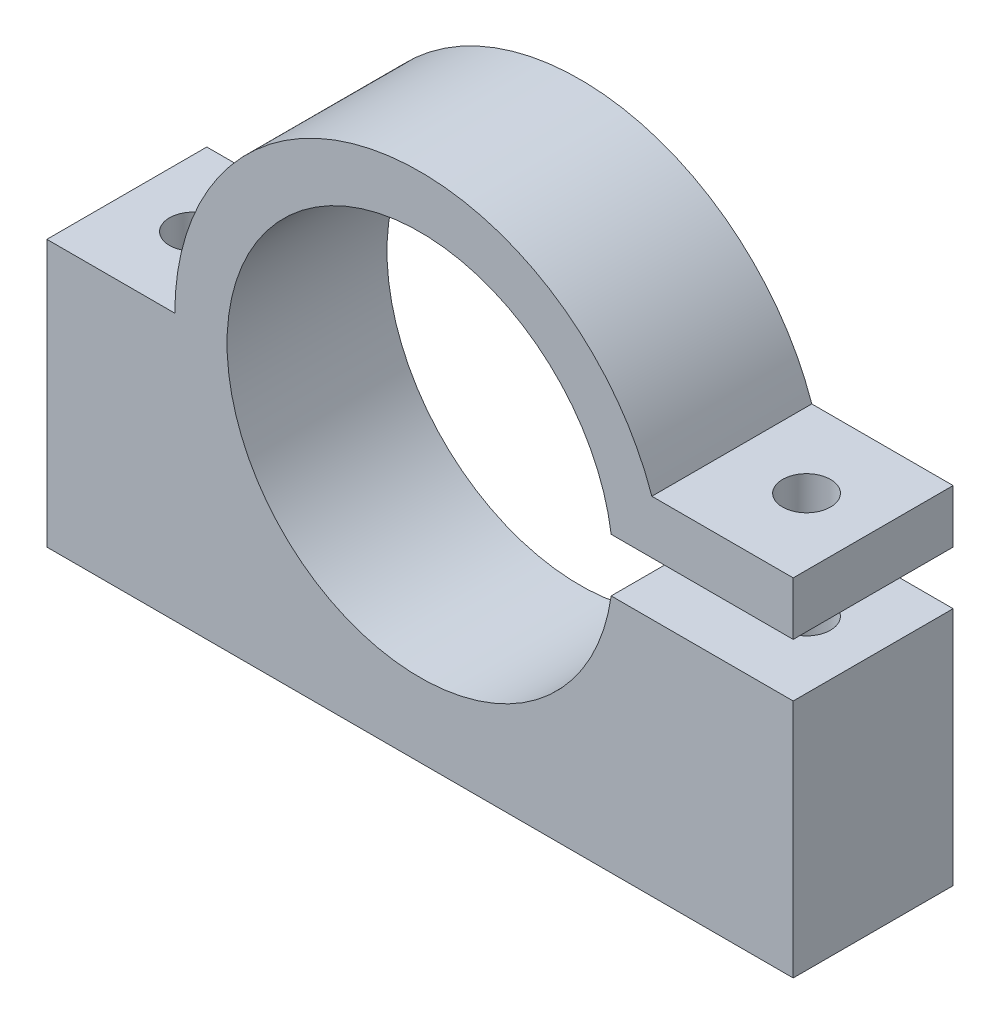
ISO-10303-21;
HEADER;
FILE_DESCRIPTION(('STEP AP214'),'2;1');
FILE_NAME('part.step','',(''),(''),'','','');
FILE_SCHEMA(('AUTOMOTIVE_DESIGN { 1 0 10303 214 1 1 1 1 }'));
ENDSEC;
DATA;
#1=APPLICATION_CONTEXT('core data for automotive mechanical design processes');
#2=APPLICATION_PROTOCOL_DEFINITION('international standard','automotive_design',2000,#1);
#3=PRODUCT_CONTEXT('',#1,'mechanical');
#4=PRODUCT('Part','Part','',(#3));
#5=PRODUCT_RELATED_PRODUCT_CATEGORY('part','',(#4));
#6=PRODUCT_DEFINITION_FORMATION('','',#4);
#7=PRODUCT_DEFINITION_CONTEXT('part definition',#1,'design');
#8=PRODUCT_DEFINITION('design','',#6,#7);
#9=PRODUCT_DEFINITION_SHAPE('','',#8);
#10=(LENGTH_UNIT() NAMED_UNIT(*) SI_UNIT(.MILLI.,.METRE.));
#11=(NAMED_UNIT(*) PLANE_ANGLE_UNIT() SI_UNIT($,.RADIAN.));
#12=(NAMED_UNIT(*) SI_UNIT($,.STERADIAN.) SOLID_ANGLE_UNIT());
#13=UNCERTAINTY_MEASURE_WITH_UNIT(LENGTH_MEASURE(1.E-05),#10,'distance_accuracy_value','');
#14=(GEOMETRIC_REPRESENTATION_CONTEXT(3) GLOBAL_UNCERTAINTY_ASSIGNED_CONTEXT((#13)) GLOBAL_UNIT_ASSIGNED_CONTEXT((#10,
#11,#12)) REPRESENTATION_CONTEXT('',''));
#15=CARTESIAN_POINT('',(0.,0.,0.));
#16=DIRECTION('',(0.,0.,1.));
#17=DIRECTION('',(1.,0.,0.));
#18=AXIS2_PLACEMENT_3D('',#15,#16,#17);
#19=CARTESIAN_POINT('',(0.,0.,15.));
#20=DIRECTION('',(0.,0.,-1.));
#21=DIRECTION('',(-1.,0.,0.));
#22=AXIS2_PLACEMENT_3D('',#19,#20,#21);
#23=CYLINDRICAL_SURFACE('',#22,18.1);
#24=CARTESIAN_POINT('',(0.,0.,0.));
#25=DIRECTION('',(0.,0.,1.));
#26=DIRECTION('',(1.,0.,0.));
#27=AXIS2_PLACEMENT_3D('',#24,#25,#26);
#28=CIRCLE('',#27,18.1);
#29=CARTESIAN_POINT('',(17.9265166722372,2.5,0.));
#30=VERTEX_POINT('',#29);
#31=CARTESIAN_POINT('',(17.9265166722372,-2.5,0.));
#32=VERTEX_POINT('',#31);
#33=EDGE_CURVE('E143',#30,#32,#28,.T.);
#34=ORIENTED_EDGE('',*,*,#33,.F.);
#35=DIRECTION('',(0.,0.,-1.));
#36=VECTOR('',#35,1.);
#37=CARTESIAN_POINT('',(17.9265166722372,2.5,15.));
#38=LINE('',#37,#36);
#39=CARTESIAN_POINT('',(17.9265166722372,2.5,15.));
#40=VERTEX_POINT('',#39);
#41=EDGE_CURVE('E11',#40,#30,#38,.T.);
#42=ORIENTED_EDGE('',*,*,#41,.F.);
#43=CARTESIAN_POINT('',(0.,0.,15.));
#44=DIRECTION('',(0.,0.,1.));
#45=DIRECTION('',(1.,0.,0.));
#46=AXIS2_PLACEMENT_3D('',#43,#44,#45);
#47=CIRCLE('',#46,18.1);
#48=CARTESIAN_POINT('',(17.9265166722372,-2.5,15.));
#49=VERTEX_POINT('',#48);
#50=EDGE_CURVE('E163',#40,#49,#47,.T.);
#51=ORIENTED_EDGE('',*,*,#50,.T.);
#52=DIRECTION('',(0.,0.,-1.));
#53=VECTOR('',#52,1.);
#54=CARTESIAN_POINT('',(17.9265166722372,-2.5,15.));
#55=LINE('',#54,#53);
#56=EDGE_CURVE('E95',#49,#32,#55,.T.);
#57=ORIENTED_EDGE('',*,*,#56,.T.);
#58=EDGE_LOOP('',(#34,#42,#51,#57));
#59=FACE_BOUND('',#58,.T.);
#60=ADVANCED_FACE('F37',(#59),#23,.F.);
#61=CARTESIAN_POINT('',(0.,2.5,15.));
#62=DIRECTION('',(0.,1.,0.));
#63=DIRECTION('',(0.,0.,1.));
#64=AXIS2_PLACEMENT_3D('',#61,#62,#63);
#65=PLANE('',#64);
#66=CARTESIAN_POINT('',(28.75,2.5,7.5));
#67=DIRECTION('',(0.,1.,0.));
#68=DIRECTION('',(0.,0.,1.));
#69=AXIS2_PLACEMENT_3D('',#66,#67,#68);
#70=CIRCLE('',#69,2.25);
#71=CARTESIAN_POINT('',(28.75,2.5,9.75));
#72=VERTEX_POINT('',#71);
#73=EDGE_CURVE('E147',#72,#72,#70,.T.);
#74=ORIENTED_EDGE('',*,*,#73,.T.);
#75=EDGE_LOOP('',(#74));
#76=FACE_BOUND('',#75,.T.);
#77=DIRECTION('',(1.,0.,0.));
#78=VECTOR('',#77,1.);
#79=CARTESIAN_POINT('',(0.,2.5,0.));
#80=LINE('',#79,#78);
#81=CARTESIAN_POINT('',(35.,2.5,0.));
#82=VERTEX_POINT('',#81);
#83=EDGE_CURVE('E146',#30,#82,#80,.T.);
#84=ORIENTED_EDGE('',*,*,#83,.T.);
#85=DIRECTION('',(0.,0.,-1.));
#86=VECTOR('',#85,1.);
#87=CARTESIAN_POINT('',(35.,2.5,15.));
#88=LINE('',#87,#86);
#89=CARTESIAN_POINT('',(35.,2.5,15.));
#90=VERTEX_POINT('',#89);
#91=EDGE_CURVE('E46',#90,#82,#88,.T.);
#92=ORIENTED_EDGE('',*,*,#91,.F.);
#93=DIRECTION('',(1.,0.,0.));
#94=VECTOR('',#93,1.);
#95=CARTESIAN_POINT('',(0.,2.5,15.));
#96=LINE('',#95,#94);
#97=EDGE_CURVE('E211',#40,#90,#96,.T.);
#98=ORIENTED_EDGE('',*,*,#97,.F.);
#99=ORIENTED_EDGE('',*,*,#41,.T.);
#100=EDGE_LOOP('',(#84,#92,#98,#99));
#101=FACE_BOUND('',#100,.T.);
#102=ADVANCED_FACE('F249',(#76,#101),#65,.F.);
#103=CARTESIAN_POINT('',(35.,0.,15.));
#104=DIRECTION('',(-1.,0.,0.));
#105=DIRECTION('',(0.,0.,1.));
#106=AXIS2_PLACEMENT_3D('',#103,#104,#105);
#107=PLANE('',#106);
#108=DIRECTION('',(0.,1.,0.));
#109=VECTOR('',#108,1.);
#110=CARTESIAN_POINT('',(35.,0.,0.));
#111=LINE('',#110,#109);
#112=CARTESIAN_POINT('',(35.,7.5,0.));
#113=VERTEX_POINT('',#112);
#114=EDGE_CURVE('E149',#82,#113,#111,.T.);
#115=ORIENTED_EDGE('',*,*,#114,.T.);
#116=DIRECTION('',(0.,0.,-1.));
#117=VECTOR('',#116,1.);
#118=CARTESIAN_POINT('',(35.,7.5,15.));
#119=LINE('',#118,#117);
#120=CARTESIAN_POINT('',(35.,7.5,15.));
#121=VERTEX_POINT('',#120);
#122=EDGE_CURVE('E176',#121,#113,#119,.T.);
#123=ORIENTED_EDGE('',*,*,#122,.F.);
#124=DIRECTION('',(0.,1.,0.));
#125=VECTOR('',#124,1.);
#126=CARTESIAN_POINT('',(35.,0.,15.));
#127=LINE('',#126,#125);
#128=EDGE_CURVE('E186',#90,#121,#127,.T.);
#129=ORIENTED_EDGE('',*,*,#128,.F.);
#130=ORIENTED_EDGE('',*,*,#91,.T.);
#131=EDGE_LOOP('',(#115,#123,#129,#130));
#132=FACE_BOUND('',#131,.T.);
#133=ADVANCED_FACE('F184',(#132),#107,.F.);
#134=CARTESIAN_POINT('',(0.,7.5,15.));
#135=DIRECTION('',(0.,-1.,0.));
#136=DIRECTION('',(1.,0.,0.));
#137=AXIS2_PLACEMENT_3D('',#134,#135,#136);
#138=PLANE('',#137);
#139=CARTESIAN_POINT('',(28.75,7.5,7.5));
#140=DIRECTION('',(0.,-1.,0.));
#141=DIRECTION('',(1.,0.,0.));
#142=AXIS2_PLACEMENT_3D('',#139,#140,#141);
#143=CIRCLE('',#142,2.25);
#144=CARTESIAN_POINT('',(31.,7.5,7.5));
#145=VERTEX_POINT('',#144);
#146=EDGE_CURVE('E216',#145,#145,#143,.T.);
#147=ORIENTED_EDGE('',*,*,#146,.T.);
#148=EDGE_LOOP('',(#147));
#149=FACE_BOUND('',#148,.T.);
#150=DIRECTION('',(-1.,0.,0.));
#151=VECTOR('',#150,1.);
#152=CARTESIAN_POINT('',(0.,7.5,0.));
#153=LINE('',#152,#151);
#154=CARTESIAN_POINT('',(21.7428149051589,7.5,0.));
#155=VERTEX_POINT('',#154);
#156=EDGE_CURVE('E151',#113,#155,#153,.T.);
#157=ORIENTED_EDGE('',*,*,#156,.T.);
#158=DIRECTION('',(0.,0.,-1.));
#159=VECTOR('',#158,1.);
#160=CARTESIAN_POINT('',(21.7428149051589,7.5,15.));
#161=LINE('',#160,#159);
#162=CARTESIAN_POINT('',(21.7428149051589,7.5,15.));
#163=VERTEX_POINT('',#162);
#164=EDGE_CURVE('E173',#163,#155,#161,.T.);
#165=ORIENTED_EDGE('',*,*,#164,.F.);
#166=DIRECTION('',(-1.,0.,0.));
#167=VECTOR('',#166,1.);
#168=CARTESIAN_POINT('',(0.,7.5,15.));
#169=LINE('',#168,#167);
#170=EDGE_CURVE('E205',#121,#163,#169,.T.);
#171=ORIENTED_EDGE('',*,*,#170,.F.);
#172=ORIENTED_EDGE('',*,*,#122,.T.);
#173=EDGE_LOOP('',(#157,#165,#171,#172));
#174=FACE_BOUND('',#173,.T.);
#175=ADVANCED_FACE('F196',(#149,#174),#138,.F.);
#176=CARTESIAN_POINT('',(0.,0.,15.));
#177=DIRECTION('',(0.,0.,-1.));
#178=DIRECTION('',(-1.,0.,0.));
#179=AXIS2_PLACEMENT_3D('',#176,#177,#178);
#180=CYLINDRICAL_SURFACE('',#179,23.);
#181=CARTESIAN_POINT('',(0.,0.,0.));
#182=DIRECTION('',(0.,0.,1.));
#183=DIRECTION('',(1.,0.,0.));
#184=AXIS2_PLACEMENT_3D('',#181,#182,#183);
#185=CIRCLE('',#184,23.);
#186=CARTESIAN_POINT('',(-23.,0.,0.));
#187=VERTEX_POINT('',#186);
#188=EDGE_CURVE('E153',#155,#187,#185,.T.);
#189=ORIENTED_EDGE('',*,*,#188,.T.);
#190=DIRECTION('',(0.,0.,-1.));
#191=VECTOR('',#190,1.);
#192=CARTESIAN_POINT('',(-23.,0.,15.));
#193=LINE('',#192,#191);
#194=CARTESIAN_POINT('',(-23.,0.,15.));
#195=VERTEX_POINT('',#194);
#196=EDGE_CURVE('E170',#195,#187,#193,.T.);
#197=ORIENTED_EDGE('',*,*,#196,.F.);
#198=CARTESIAN_POINT('',(0.,0.,15.));
#199=DIRECTION('',(0.,0.,1.));
#200=DIRECTION('',(1.,0.,0.));
#201=AXIS2_PLACEMENT_3D('',#198,#199,#200);
#202=CIRCLE('',#201,23.);
#203=EDGE_CURVE('E202',#163,#195,#202,.T.);
#204=ORIENTED_EDGE('',*,*,#203,.F.);
#205=ORIENTED_EDGE('',*,*,#164,.T.);
#206=EDGE_LOOP('',(#189,#197,#204,#205));
#207=FACE_BOUND('',#206,.T.);
#208=ADVANCED_FACE('F200',(#207),#180,.T.);
#209=CARTESIAN_POINT('',(0.,0.,15.));
#210=DIRECTION('',(0.,-1.,0.));
#211=DIRECTION('',(1.,0.,0.));
#212=AXIS2_PLACEMENT_3D('',#209,#210,#211);
#213=PLANE('',#212);
#214=CARTESIAN_POINT('',(-28.75,0.,7.5));
#215=DIRECTION('',(0.,-1.,0.));
#216=DIRECTION('',(1.,0.,0.));
#217=AXIS2_PLACEMENT_3D('',#214,#215,#216);
#218=CIRCLE('',#217,2.25);
#219=CARTESIAN_POINT('',(-26.5,0.,7.5));
#220=VERTEX_POINT('',#219);
#221=EDGE_CURVE('E222',#220,#220,#218,.T.);
#222=ORIENTED_EDGE('',*,*,#221,.T.);
#223=EDGE_LOOP('',(#222));
#224=FACE_BOUND('',#223,.T.);
#225=DIRECTION('',(-1.,0.,0.));
#226=VECTOR('',#225,1.);
#227=CARTESIAN_POINT('',(0.,0.,0.));
#228=LINE('',#227,#226);
#229=CARTESIAN_POINT('',(-35.,0.,0.));
#230=VERTEX_POINT('',#229);
#231=EDGE_CURVE('E155',#187,#230,#228,.T.);
#232=ORIENTED_EDGE('',*,*,#231,.T.);
#233=DIRECTION('',(0.,0.,-1.));
#234=VECTOR('',#233,1.);
#235=CARTESIAN_POINT('',(-35.,0.,15.));
#236=LINE('',#235,#234);
#237=CARTESIAN_POINT('',(-35.,0.,15.));
#238=VERTEX_POINT('',#237);
#239=EDGE_CURVE('E167',#238,#230,#236,.T.);
#240=ORIENTED_EDGE('',*,*,#239,.F.);
#241=DIRECTION('',(-1.,0.,0.));
#242=VECTOR('',#241,1.);
#243=CARTESIAN_POINT('',(0.,0.,15.));
#244=LINE('',#243,#242);
#245=EDGE_CURVE('E204',#195,#238,#244,.T.);
#246=ORIENTED_EDGE('',*,*,#245,.F.);
#247=ORIENTED_EDGE('',*,*,#196,.T.);
#248=EDGE_LOOP('',(#232,#240,#246,#247));
#249=FACE_BOUND('',#248,.T.);
#250=ADVANCED_FACE('F238',(#224,#249),#213,.F.);
#251=CARTESIAN_POINT('',(-35.,0.,15.));
#252=DIRECTION('',(1.,0.,0.));
#253=DIRECTION('',(0.,0.,-1.));
#254=AXIS2_PLACEMENT_3D('',#251,#252,#253);
#255=PLANE('',#254);
#256=DIRECTION('',(0.,-1.,0.));
#257=VECTOR('',#256,1.);
#258=CARTESIAN_POINT('',(-35.,0.,0.));
#259=LINE('',#258,#257);
#260=CARTESIAN_POINT('',(-35.,-25.,0.));
#261=VERTEX_POINT('',#260);
#262=EDGE_CURVE('E157',#230,#261,#259,.T.);
#263=ORIENTED_EDGE('',*,*,#262,.T.);
#264=DIRECTION('',(0.,0.,-1.));
#265=VECTOR('',#264,1.);
#266=CARTESIAN_POINT('',(-35.,-25.,15.));
#267=LINE('',#266,#265);
#268=CARTESIAN_POINT('',(-35.,-25.,15.));
#269=VERTEX_POINT('',#268);
#270=EDGE_CURVE('E135',#269,#261,#267,.T.);
#271=ORIENTED_EDGE('',*,*,#270,.F.);
#272=DIRECTION('',(0.,-1.,0.));
#273=VECTOR('',#272,1.);
#274=CARTESIAN_POINT('',(-35.,0.,15.));
#275=LINE('',#274,#273);
#276=EDGE_CURVE('E126',#238,#269,#275,.T.);
#277=ORIENTED_EDGE('',*,*,#276,.F.);
#278=ORIENTED_EDGE('',*,*,#239,.T.);
#279=EDGE_LOOP('',(#263,#271,#277,#278));
#280=FACE_BOUND('',#279,.T.);
#281=ADVANCED_FACE('F241',(#280),#255,.F.);
#282=CARTESIAN_POINT('',(0.,-25.,15.));
#283=DIRECTION('',(0.,1.,0.));
#284=DIRECTION('',(0.,0.,1.));
#285=AXIS2_PLACEMENT_3D('',#282,#283,#284);
#286=PLANE('',#285);
#287=CARTESIAN_POINT('',(-28.75,-25.,7.5));
#288=DIRECTION('',(0.,1.,0.));
#289=DIRECTION('',(-1.,0.,0.));
#290=AXIS2_PLACEMENT_3D('',#287,#288,#289);
#291=CIRCLE('',#290,2.25);
#292=CARTESIAN_POINT('',(-31.,-25.,7.5));
#293=VERTEX_POINT('',#292);
#294=EDGE_CURVE('E225',#293,#293,#291,.T.);
#295=ORIENTED_EDGE('',*,*,#294,.T.);
#296=EDGE_LOOP('',(#295));
#297=FACE_BOUND('',#296,.T.);
#298=CARTESIAN_POINT('',(28.75,-25.,7.5));
#299=DIRECTION('',(0.,1.,0.));
#300=DIRECTION('',(-1.,0.,0.));
#301=AXIS2_PLACEMENT_3D('',#298,#299,#300);
#302=CIRCLE('',#301,2.25);
#303=CARTESIAN_POINT('',(26.5,-25.,7.5));
#304=VERTEX_POINT('',#303);
#305=EDGE_CURVE('E219',#304,#304,#302,.T.);
#306=ORIENTED_EDGE('',*,*,#305,.T.);
#307=EDGE_LOOP('',(#306));
#308=FACE_BOUND('',#307,.T.);
#309=DIRECTION('',(1.,0.,0.));
#310=VECTOR('',#309,1.);
#311=CARTESIAN_POINT('',(0.,-25.,0.));
#312=LINE('',#311,#310);
#313=CARTESIAN_POINT('',(35.,-25.,0.));
#314=VERTEX_POINT('',#313);
#315=EDGE_CURVE('E134',#261,#314,#312,.T.);
#316=ORIENTED_EDGE('',*,*,#315,.T.);
#317=DIRECTION('',(0.,0.,-1.));
#318=VECTOR('',#317,1.);
#319=CARTESIAN_POINT('',(35.,-25.,15.));
#320=LINE('',#319,#318);
#321=CARTESIAN_POINT('',(35.,-25.,15.));
#322=VERTEX_POINT('',#321);
#323=EDGE_CURVE('E131',#322,#314,#320,.T.);
#324=ORIENTED_EDGE('',*,*,#323,.F.);
#325=DIRECTION('',(1.,0.,0.));
#326=VECTOR('',#325,1.);
#327=CARTESIAN_POINT('',(0.,-25.,15.));
#328=LINE('',#327,#326);
#329=EDGE_CURVE('E120',#269,#322,#328,.T.);
#330=ORIENTED_EDGE('',*,*,#329,.F.);
#331=ORIENTED_EDGE('',*,*,#270,.T.);
#332=EDGE_LOOP('',(#316,#324,#330,#331));
#333=FACE_BOUND('',#332,.T.);
#334=ADVANCED_FACE('F132',(#297,#308,#333),#286,.F.);
#335=CARTESIAN_POINT('',(35.,0.,15.));
#336=DIRECTION('',(-1.,0.,0.));
#337=DIRECTION('',(0.,0.,1.));
#338=AXIS2_PLACEMENT_3D('',#335,#336,#337);
#339=PLANE('',#338);
#340=DIRECTION('',(0.,1.,0.));
#341=VECTOR('',#340,1.);
#342=CARTESIAN_POINT('',(35.,0.,0.));
#343=LINE('',#342,#341);
#344=CARTESIAN_POINT('',(35.,-2.5,0.));
#345=VERTEX_POINT('',#344);
#346=EDGE_CURVE('E88',#314,#345,#343,.T.);
#347=ORIENTED_EDGE('',*,*,#346,.T.);
#348=DIRECTION('',(0.,0.,-1.));
#349=VECTOR('',#348,1.);
#350=CARTESIAN_POINT('',(35.,-2.5,15.));
#351=LINE('',#350,#349);
#352=CARTESIAN_POINT('',(35.,-2.5,15.));
#353=VERTEX_POINT('',#352);
#354=EDGE_CURVE('E136',#353,#345,#351,.T.);
#355=ORIENTED_EDGE('',*,*,#354,.F.);
#356=DIRECTION('',(0.,1.,0.));
#357=VECTOR('',#356,1.);
#358=CARTESIAN_POINT('',(35.,0.,15.));
#359=LINE('',#358,#357);
#360=EDGE_CURVE('E124',#322,#353,#359,.T.);
#361=ORIENTED_EDGE('',*,*,#360,.F.);
#362=ORIENTED_EDGE('',*,*,#323,.T.);
#363=EDGE_LOOP('',(#347,#355,#361,#362));
#364=FACE_BOUND('',#363,.T.);
#365=ADVANCED_FACE('F138',(#364),#339,.F.);
#366=CARTESIAN_POINT('',(0.,-2.5,15.));
#367=DIRECTION('',(0.,-1.,0.));
#368=DIRECTION('',(1.,0.,0.));
#369=AXIS2_PLACEMENT_3D('',#366,#367,#368);
#370=PLANE('',#369);
#371=CARTESIAN_POINT('',(28.75,-2.5,7.5));
#372=DIRECTION('',(0.,-1.,0.));
#373=DIRECTION('',(1.,0.,0.));
#374=AXIS2_PLACEMENT_3D('',#371,#372,#373);
#375=CIRCLE('',#374,2.25);
#376=CARTESIAN_POINT('',(31.,-2.5,7.5));
#377=VERTEX_POINT('',#376);
#378=EDGE_CURVE('E40',#377,#377,#375,.T.);
#379=ORIENTED_EDGE('',*,*,#378,.T.);
#380=EDGE_LOOP('',(#379));
#381=FACE_BOUND('',#380,.T.);
#382=DIRECTION('',(-1.,0.,0.));
#383=VECTOR('',#382,1.);
#384=CARTESIAN_POINT('',(0.,-2.5,0.));
#385=LINE('',#384,#383);
#386=EDGE_CURVE('E161',#345,#32,#385,.T.);
#387=ORIENTED_EDGE('',*,*,#386,.T.);
#388=ORIENTED_EDGE('',*,*,#56,.F.);
#389=DIRECTION('',(-1.,0.,0.));
#390=VECTOR('',#389,1.);
#391=CARTESIAN_POINT('',(0.,-2.5,15.));
#392=LINE('',#391,#390);
#393=EDGE_CURVE('E54',#353,#49,#392,.T.);
#394=ORIENTED_EDGE('',*,*,#393,.F.);
#395=ORIENTED_EDGE('',*,*,#354,.T.);
#396=EDGE_LOOP('',(#387,#388,#394,#395));
#397=FACE_BOUND('',#396,.T.);
#398=ADVANCED_FACE('F248',(#381,#397),#370,.F.);
#399=CARTESIAN_POINT('',(0.,0.,15.));
#400=DIRECTION('',(0.,0.,1.));
#401=DIRECTION('',(1.,0.,0.));
#402=AXIS2_PLACEMENT_3D('',#399,#400,#401);
#403=PLANE('',#402);
#404=ORIENTED_EDGE('',*,*,#50,.F.);
#405=ORIENTED_EDGE('',*,*,#97,.T.);
#406=ORIENTED_EDGE('',*,*,#128,.T.);
#407=ORIENTED_EDGE('',*,*,#170,.T.);
#408=ORIENTED_EDGE('',*,*,#203,.T.);
#409=ORIENTED_EDGE('',*,*,#245,.T.);
#410=ORIENTED_EDGE('',*,*,#276,.T.);
#411=ORIENTED_EDGE('',*,*,#329,.T.);
#412=ORIENTED_EDGE('',*,*,#360,.T.);
#413=ORIENTED_EDGE('',*,*,#393,.T.);
#414=EDGE_LOOP('',(#404,#405,#406,#407,#408,#409,#410,#411,#412,#413));
#415=FACE_BOUND('',#414,.T.);
#416=ADVANCED_FACE('F122',(#415),#403,.T.);
#417=CARTESIAN_POINT('',(0.,0.,0.));
#418=DIRECTION('',(0.,0.,1.));
#419=DIRECTION('',(1.,0.,0.));
#420=AXIS2_PLACEMENT_3D('',#417,#418,#419);
#421=PLANE('',#420);
#422=ORIENTED_EDGE('',*,*,#33,.T.);
#423=ORIENTED_EDGE('',*,*,#386,.F.);
#424=ORIENTED_EDGE('',*,*,#346,.F.);
#425=ORIENTED_EDGE('',*,*,#315,.F.);
#426=ORIENTED_EDGE('',*,*,#262,.F.);
#427=ORIENTED_EDGE('',*,*,#231,.F.);
#428=ORIENTED_EDGE('',*,*,#188,.F.);
#429=ORIENTED_EDGE('',*,*,#156,.F.);
#430=ORIENTED_EDGE('',*,*,#114,.F.);
#431=ORIENTED_EDGE('',*,*,#83,.F.);
#432=EDGE_LOOP('',(#422,#423,#424,#425,#426,#427,#428,#429,#430,#431));
#433=FACE_BOUND('',#432,.T.);
#434=ADVANCED_FACE('F191',(#433),#421,.F.);
#435=CARTESIAN_POINT('',(28.75,-25.,7.5));
#436=DIRECTION('',(0.,1.,0.));
#437=DIRECTION('',(-1.,0.,0.));
#438=AXIS2_PLACEMENT_3D('',#435,#436,#437);
#439=CYLINDRICAL_SURFACE('',#438,2.25);
#440=ORIENTED_EDGE('',*,*,#305,.F.);
#441=EDGE_LOOP('',(#440));
#442=FACE_BOUND('',#441,.T.);
#443=ORIENTED_EDGE('',*,*,#378,.F.);
#444=EDGE_LOOP('',(#443));
#445=FACE_BOUND('',#444,.T.);
#446=ADVANCED_FACE('F274',(#442,#445),#439,.F.);
#447=ORIENTED_EDGE('',*,*,#146,.F.);
#448=EDGE_LOOP('',(#447));
#449=FACE_BOUND('',#448,.T.);
#450=ORIENTED_EDGE('',*,*,#73,.F.);
#451=EDGE_LOOP('',(#450));
#452=FACE_BOUND('',#451,.T.);
#453=ADVANCED_FACE('F234',(#449,#452),#439,.F.);
#454=CARTESIAN_POINT('',(-28.75,-25.,7.5));
#455=DIRECTION('',(0.,1.,0.));
#456=DIRECTION('',(-1.,0.,0.));
#457=AXIS2_PLACEMENT_3D('',#454,#455,#456);
#458=CYLINDRICAL_SURFACE('',#457,2.25);
#459=ORIENTED_EDGE('',*,*,#294,.F.);
#460=EDGE_LOOP('',(#459));
#461=FACE_BOUND('',#460,.T.);
#462=ORIENTED_EDGE('',*,*,#221,.F.);
#463=EDGE_LOOP('',(#462));
#464=FACE_BOUND('',#463,.T.);
#465=ADVANCED_FACE('F231',(#461,#464),#458,.F.);
#466=CLOSED_SHELL('',(#60,#102,#133,#175,#208,#250,#281,#334,#365,#398,#416,#434,#446,#453,#465));
#467=MANIFOLD_SOLID_BREP('B2',#466);
#468=ADVANCED_BREP_SHAPE_REPRESENTATION('',(#18,#467),#14);
#469=SHAPE_DEFINITION_REPRESENTATION(#9,#468);
ENDSEC;
END-ISO-10303-21;
